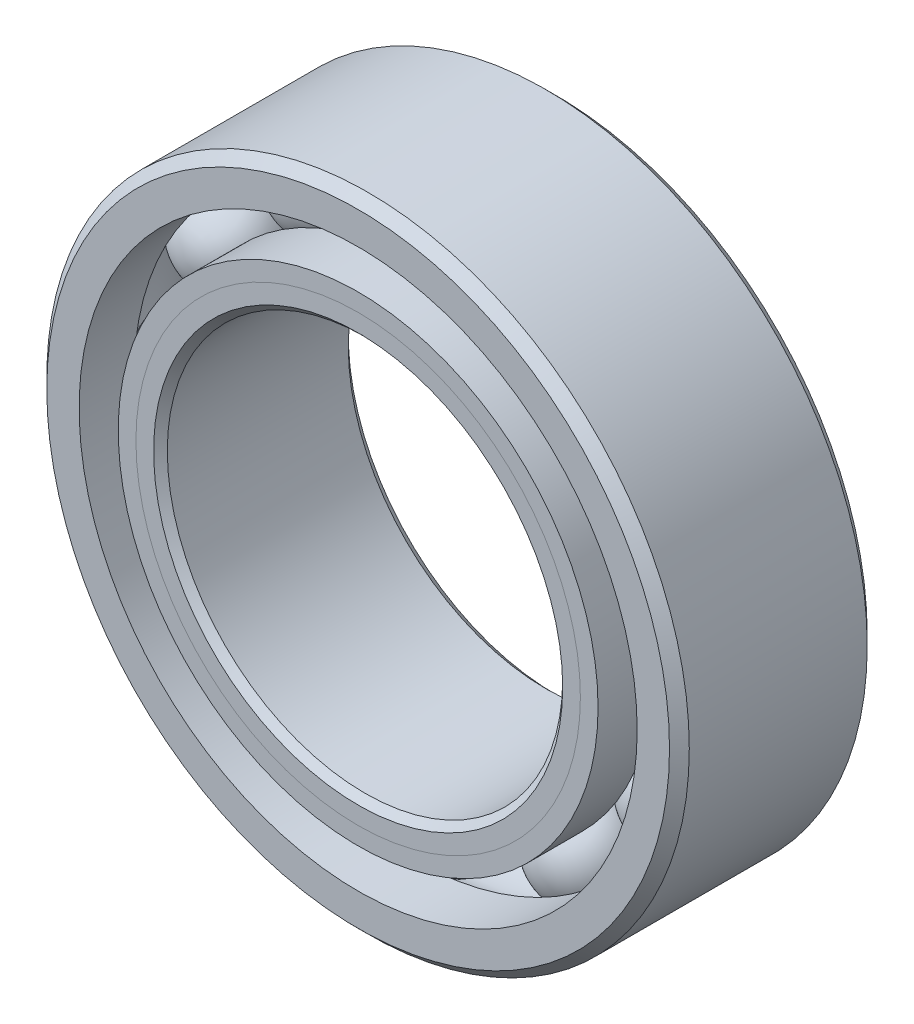
ISO-10303-21;
HEADER;
FILE_DESCRIPTION(('STEP AP214'),'2;1');
FILE_NAME('part.step','',(''),(''),'','','');
FILE_SCHEMA(('AUTOMOTIVE_DESIGN { 1 0 10303 214 1 1 1 1 }'));
ENDSEC;
DATA;
#1=APPLICATION_CONTEXT('core data for automotive mechanical design processes');
#2=APPLICATION_PROTOCOL_DEFINITION('international standard','automotive_design',2000,#1);
#3=PRODUCT_CONTEXT('',#1,'mechanical');
#4=PRODUCT('Part','Part','',(#3));
#5=PRODUCT_RELATED_PRODUCT_CATEGORY('part','',(#4));
#6=PRODUCT_DEFINITION_FORMATION('','',#4);
#7=PRODUCT_DEFINITION_CONTEXT('part definition',#1,'design');
#8=PRODUCT_DEFINITION('design','',#6,#7);
#9=PRODUCT_DEFINITION_SHAPE('','',#8);
#10=(LENGTH_UNIT() NAMED_UNIT(*) SI_UNIT(.MILLI.,.METRE.));
#11=(NAMED_UNIT(*) PLANE_ANGLE_UNIT() SI_UNIT($,.RADIAN.));
#12=(NAMED_UNIT(*) SI_UNIT($,.STERADIAN.) SOLID_ANGLE_UNIT());
#13=UNCERTAINTY_MEASURE_WITH_UNIT(LENGTH_MEASURE(1.E-05),#10,'distance_accuracy_value','');
#14=(GEOMETRIC_REPRESENTATION_CONTEXT(3) GLOBAL_UNCERTAINTY_ASSIGNED_CONTEXT((#13)) GLOBAL_UNIT_ASSIGNED_CONTEXT((#10,
#11,#12)) REPRESENTATION_CONTEXT('',''));
#15=CARTESIAN_POINT('',(0.,0.,0.));
#16=DIRECTION('',(0.,0.,1.));
#17=DIRECTION('',(1.,0.,0.));
#18=AXIS2_PLACEMENT_3D('',#15,#16,#17);
#19=CARTESIAN_POINT('',(-8.33437499999981,14.435560949332,0.));
#20=DIRECTION('',(0.,0.,1.));
#21=DIRECTION('',(-0.499999999999989,0.866025403784445,0.));
#22=AXIS2_PLACEMENT_3D('',#19,#20,#21);
#23=SPHERICAL_SURFACE('',#22,3.08910742628344);
#24=CARTESIAN_POINT('',(-8.33437499999981,14.435560949332,3.08910742628344));
#25=VERTEX_POINT('',#24);
#26=VERTEX_LOOP('',#25);
#27=FACE_BOUND('',#26,.T.);
#28=ADVANCED_FACE('F37',(#27),#23,.T.);
#29=CLOSED_SHELL('',(#28));
#30=MANIFOLD_SOLID_BREP('B2',#29);
#31=CARTESIAN_POINT('',(-14.4355609493318,8.33437500000017,0.));
#32=DIRECTION('',(0.,0.,1.));
#33=DIRECTION('',(-0.866025403784433,0.50000000000001,0.));
#34=AXIS2_PLACEMENT_3D('',#31,#32,#33);
#35=SPHERICAL_SURFACE('',#34,3.08910742628344);
#36=CARTESIAN_POINT('',(-14.4355609493318,8.33437500000017,3.08910742628344));
#37=VERTEX_POINT('',#36);
#38=VERTEX_LOOP('',#37);
#39=FACE_BOUND('',#38,.T.);
#40=ADVANCED_FACE('F68',(#39),#35,.T.);
#41=CLOSED_SHELL('',(#40));
#42=MANIFOLD_SOLID_BREP('B6',#41);
#43=CARTESIAN_POINT('',(-16.66875,1.74595888700524E-13,0.));
#44=DIRECTION('',(0.,0.,1.));
#45=DIRECTION('',(-1.,0.,0.));
#46=AXIS2_PLACEMENT_3D('',#43,#44,#45);
#47=SPHERICAL_SURFACE('',#46,3.08910742628344);
#48=CARTESIAN_POINT('',(-16.66875,1.74595888700524E-13,3.08910742628344));
#49=VERTEX_POINT('',#48);
#50=VERTEX_LOOP('',#49);
#51=FACE_BOUND('',#50,.T.);
#52=ADVANCED_FACE('F99',(#51),#47,.T.);
#53=CLOSED_SHELL('',(#52));
#54=MANIFOLD_SOLID_BREP('B33',#53);
#55=CARTESIAN_POINT('',(-14.4355609493319,-8.33437499999987,0.));
#56=DIRECTION('',(0.,0.,1.));
#57=DIRECTION('',(-0.866025403784443,-0.499999999999992,0.));
#58=AXIS2_PLACEMENT_3D('',#55,#56,#57);
#59=SPHERICAL_SURFACE('',#58,3.08910742628344);
#60=CARTESIAN_POINT('',(-14.4355609493319,-8.33437499999987,3.08910742628344));
#61=VERTEX_POINT('',#60);
#62=VERTEX_LOOP('',#61);
#63=FACE_BOUND('',#62,.T.);
#64=ADVANCED_FACE('F130',(#63),#59,.T.);
#65=CLOSED_SHELL('',(#64));
#66=MANIFOLD_SOLID_BREP('B64',#65);
#67=CARTESIAN_POINT('',(-8.33437500000012,-14.4355609493318,0.));
#68=DIRECTION('',(0.,0.,1.));
#69=DIRECTION('',(-0.500000000000007,-0.866025403784435,0.));
#70=AXIS2_PLACEMENT_3D('',#67,#68,#69);
#71=SPHERICAL_SURFACE('',#70,3.08910742628344);
#72=CARTESIAN_POINT('',(-8.33437500000012,-14.4355609493318,3.08910742628344));
#73=VERTEX_POINT('',#72);
#74=VERTEX_LOOP('',#73);
#75=FACE_BOUND('',#74,.T.);
#76=ADVANCED_FACE('F161',(#75),#71,.T.);
#77=CLOSED_SHELL('',(#76));
#78=MANIFOLD_SOLID_BREP('B95',#77);
#79=CARTESIAN_POINT('',(-1.16397259133683E-13,-16.66875,0.));
#80=DIRECTION('',(0.,0.,1.));
#81=DIRECTION('',(0.,-1.,0.));
#82=AXIS2_PLACEMENT_3D('',#79,#80,#81);
#83=SPHERICAL_SURFACE('',#82,3.08910742628344);
#84=CARTESIAN_POINT('',(-1.16397259133683E-13,-16.66875,3.08910742628344));
#85=VERTEX_POINT('',#84);
#86=VERTEX_LOOP('',#85);
#87=FACE_BOUND('',#86,.T.);
#88=ADVANCED_FACE('F192',(#87),#83,.T.);
#89=CLOSED_SHELL('',(#88));
#90=MANIFOLD_SOLID_BREP('B126',#89);
#91=CARTESIAN_POINT('',(8.33437499999991,-14.4355609493319,0.));
#92=DIRECTION('',(0.,0.,1.));
#93=DIRECTION('',(0.499999999999995,-0.866025403784442,0.));
#94=AXIS2_PLACEMENT_3D('',#91,#92,#93);
#95=SPHERICAL_SURFACE('',#94,3.08910742628344);
#96=CARTESIAN_POINT('',(8.33437499999991,-14.4355609493319,3.08910742628344));
#97=VERTEX_POINT('',#96);
#98=VERTEX_LOOP('',#97);
#99=FACE_BOUND('',#98,.T.);
#100=ADVANCED_FACE('F223',(#99),#95,.T.);
#101=CLOSED_SHELL('',(#100));
#102=MANIFOLD_SOLID_BREP('B157',#101);
#103=CARTESIAN_POINT('',(14.4355609493318,-8.33437500000007,0.));
#104=DIRECTION('',(0.,0.,1.));
#105=DIRECTION('',(0.866025403784436,-0.500000000000004,0.));
#106=AXIS2_PLACEMENT_3D('',#103,#104,#105);
#107=SPHERICAL_SURFACE('',#106,3.08910742628344);
#108=CARTESIAN_POINT('',(14.4355609493318,-8.33437500000007,3.08910742628344));
#109=VERTEX_POINT('',#108);
#110=VERTEX_LOOP('',#109);
#111=FACE_BOUND('',#110,.T.);
#112=ADVANCED_FACE('F254',(#111),#107,.T.);
#113=CLOSED_SHELL('',(#112));
#114=MANIFOLD_SOLID_BREP('B188',#113);
#115=CARTESIAN_POINT('',(16.66875,0.,0.));
#116=DIRECTION('',(0.,0.,1.));
#117=DIRECTION('',(1.,0.,0.));
#118=AXIS2_PLACEMENT_3D('',#115,#116,#117);
#119=SPHERICAL_SURFACE('',#118,3.08910742628344);
#120=CARTESIAN_POINT('',(16.66875,0.,3.08910742628344));
#121=VERTEX_POINT('',#120);
#122=VERTEX_LOOP('',#121);
#123=FACE_BOUND('',#122,.T.);
#124=ADVANCED_FACE('F285',(#123),#119,.T.);
#125=CLOSED_SHELL('',(#124));
#126=MANIFOLD_SOLID_BREP('B219',#125);
#127=CARTESIAN_POINT('',(14.4355609493319,8.33437499999997,0.));
#128=DIRECTION('',(0.,0.,1.));
#129=DIRECTION('',(0.86602540378444,0.499999999999998,0.));
#130=AXIS2_PLACEMENT_3D('',#127,#128,#129);
#131=SPHERICAL_SURFACE('',#130,3.08910742628344);
#132=CARTESIAN_POINT('',(14.4355609493319,8.33437499999997,3.08910742628344));
#133=VERTEX_POINT('',#132);
#134=VERTEX_LOOP('',#133);
#135=FACE_BOUND('',#134,.T.);
#136=ADVANCED_FACE('F316',(#135),#131,.T.);
#137=CLOSED_SHELL('',(#136));
#138=MANIFOLD_SOLID_BREP('B250',#137);
#139=CARTESIAN_POINT('',(8.33437500000002,14.4355609493319,0.));
#140=DIRECTION('',(0.,0.,1.));
#141=DIRECTION('',(0.500000000000001,0.866025403784438,0.));
#142=AXIS2_PLACEMENT_3D('',#139,#140,#141);
#143=SPHERICAL_SURFACE('',#142,3.08910742628344);
#144=CARTESIAN_POINT('',(8.33437500000002,14.4355609493319,3.08910742628344));
#145=VERTEX_POINT('',#144);
#146=VERTEX_LOOP('',#145);
#147=FACE_BOUND('',#146,.T.);
#148=ADVANCED_FACE('F347',(#147),#143,.T.);
#149=CLOSED_SHELL('',(#148));
#150=MANIFOLD_SOLID_BREP('B281',#149);
#151=CARTESIAN_POINT('',(0.,16.66875,0.));
#152=DIRECTION('',(0.,0.,1.));
#153=DIRECTION('',(0.,1.,0.));
#154=AXIS2_PLACEMENT_3D('',#151,#152,#153);
#155=SPHERICAL_SURFACE('',#154,3.08910742628344);
#156=CARTESIAN_POINT('',(0.,16.66875,3.08910742628344));
#157=VERTEX_POINT('',#156);
#158=VERTEX_LOOP('',#157);
#159=FACE_BOUND('',#158,.T.);
#160=ADVANCED_FACE('F380',(#159),#155,.T.);
#161=CLOSED_SHELL('',(#160));
#162=MANIFOLD_SOLID_BREP('B312',#161);
#163=CARTESIAN_POINT('',(0.,14.2762636654072,6.35));
#164=DIRECTION('',(0.,0.,-1.));
#165=DIRECTION('',(-1.,0.,0.));
#166=AXIS2_PLACEMENT_3D('',#163,#164,#165);
#167=PLANE('',#166);
#168=CARTESIAN_POINT('',(0.,0.,6.35));
#169=DIRECTION('',(0.,0.,1.));
#170=DIRECTION('',(1.,0.,0.));
#171=AXIS2_PLACEMENT_3D('',#168,#169,#170);
#172=CIRCLE('',#171,13.1398212868583);
#173=CARTESIAN_POINT('',(13.1398212868583,0.,6.35));
#174=VERTEX_POINT('',#173);
#175=EDGE_CURVE('E434',#174,#174,#172,.T.);
#176=ORIENTED_EDGE('',*,*,#175,.F.);
#177=EDGE_LOOP('',(#176));
#178=FACE_BOUND('',#177,.T.);
#179=CARTESIAN_POINT('',(0.,0.,6.35));
#180=DIRECTION('',(0.,0.,1.));
#181=DIRECTION('',(1.,0.,0.));
#182=AXIS2_PLACEMENT_3D('',#179,#180,#181);
#183=CIRCLE('',#182,14.2762636654072);
#184=CARTESIAN_POINT('',(14.2762636654072,0.,6.35));
#185=VERTEX_POINT('',#184);
#186=EDGE_CURVE('E379',#185,#185,#183,.T.);
#187=ORIENTED_EDGE('',*,*,#186,.T.);
#188=EDGE_LOOP('',(#187));
#189=FACE_BOUND('',#188,.T.);
#190=ADVANCED_FACE('F400',(#178,#189),#167,.F.);
#191=CARTESIAN_POINT('',(0.,0.,5.21355762145112));
#192=DIRECTION('',(0.,0.,1.));
#193=DIRECTION('',(1.,0.,0.));
#194=AXIS2_PLACEMENT_3D('',#191,#192,#193);
#195=CONICAL_SURFACE('',#194,13.1398212868583,0.78539816339745);
#196=ORIENTED_EDGE('',*,*,#186,.F.);
#197=EDGE_LOOP('',(#196));
#198=FACE_BOUND('',#197,.T.);
#199=CARTESIAN_POINT('',(0.,0.,5.21355762145112));
#200=DIRECTION('',(0.,0.,1.));
#201=DIRECTION('',(1.,0.,0.));
#202=AXIS2_PLACEMENT_3D('',#199,#200,#201);
#203=CIRCLE('',#202,13.1398212868583);
#204=CARTESIAN_POINT('',(13.1398212868583,0.,5.21355762145112));
#205=VERTEX_POINT('',#204);
#206=EDGE_CURVE('E406',#205,#205,#203,.T.);
#207=ORIENTED_EDGE('',*,*,#206,.T.);
#208=EDGE_LOOP('',(#207));
#209=FACE_BOUND('',#208,.T.);
#210=ADVANCED_FACE('F441',(#198,#209),#195,.T.);
#211=CARTESIAN_POINT('',(0.,0.,6.35));
#212=DIRECTION('',(0.,0.,1.));
#213=DIRECTION('',(1.,0.,0.));
#214=AXIS2_PLACEMENT_3D('',#211,#212,#213);
#215=CYLINDRICAL_SURFACE('',#214,13.1398212868583);
#216=ORIENTED_EDGE('',*,*,#206,.F.);
#217=EDGE_LOOP('',(#216));
#218=FACE_BOUND('',#217,.T.);
#219=CARTESIAN_POINT('',(0.,0.,0.));
#220=DIRECTION('',(0.,0.,1.));
#221=DIRECTION('',(1.,0.,0.));
#222=AXIS2_PLACEMENT_3D('',#219,#220,#221);
#223=CIRCLE('',#222,13.1398212868583);
#224=CARTESIAN_POINT('',(13.1398212868583,0.,0.));
#225=VERTEX_POINT('',#224);
#226=EDGE_CURVE('E410',#225,#225,#223,.T.);
#227=ORIENTED_EDGE('',*,*,#226,.T.);
#228=EDGE_LOOP('',(#227));
#229=FACE_BOUND('',#228,.T.);
#230=ADVANCED_FACE('F445',(#218,#229),#215,.T.);
#231=CARTESIAN_POINT('',(0.,13.1398212868583,0.));
#232=DIRECTION('',(0.,0.,-1.));
#233=DIRECTION('',(-1.,0.,0.));
#234=AXIS2_PLACEMENT_3D('',#231,#232,#233);
#235=PLANE('',#234);
#236=ORIENTED_EDGE('',*,*,#226,.F.);
#237=EDGE_LOOP('',(#236));
#238=FACE_BOUND('',#237,.T.);
#239=CARTESIAN_POINT('',(0.,0.,0.));
#240=DIRECTION('',(0.,0.,1.));
#241=DIRECTION('',(1.,0.,0.));
#242=AXIS2_PLACEMENT_3D('',#239,#240,#241);
#243=CIRCLE('',#242,13.5796425737166);
#244=CARTESIAN_POINT('',(13.5796425737166,0.,0.));
#245=VERTEX_POINT('',#244);
#246=EDGE_CURVE('E414',#245,#245,#243,.T.);
#247=ORIENTED_EDGE('',*,*,#246,.T.);
#248=EDGE_LOOP('',(#247));
#249=FACE_BOUND('',#248,.T.);
#250=ADVANCED_FACE('F450',(#238,#249),#235,.F.);
#251=CARTESIAN_POINT('',(0.,0.,0.));
#252=DIRECTION('',(0.,0.,1.));
#253=DIRECTION('',(1.,0.,0.));
#254=AXIS2_PLACEMENT_3D('',#251,#252,#253);
#255=TOROIDAL_SURFACE('',#254,16.66875,3.08910742628344);
#256=ORIENTED_EDGE('',*,*,#246,.F.);
#257=EDGE_LOOP('',(#256));
#258=FACE_BOUND('',#257,.T.);
#259=CARTESIAN_POINT('',(0.,0.,-2.82222222222222));
#260=DIRECTION('',(0.,0.,1.));
#261=DIRECTION('',(1.,0.,0.));
#262=AXIS2_PLACEMENT_3D('',#259,#260,#261);
#263=CIRCLE('',#262,15.412706043956);
#264=CARTESIAN_POINT('',(15.412706043956,0.,-2.82222222222222));
#265=VERTEX_POINT('',#264);
#266=EDGE_CURVE('E419',#265,#265,#263,.T.);
#267=ORIENTED_EDGE('',*,*,#266,.T.);
#268=EDGE_LOOP('',(#267));
#269=FACE_BOUND('',#268,.T.);
#270=ADVANCED_FACE('F456',(#258,#269),#255,.F.);
#271=CARTESIAN_POINT('',(0.,0.,6.35));
#272=DIRECTION('',(0.,0.,1.));
#273=DIRECTION('',(1.,0.,0.));
#274=AXIS2_PLACEMENT_3D('',#271,#272,#273);
#275=CYLINDRICAL_SURFACE('',#274,15.412706043956);
#276=ORIENTED_EDGE('',*,*,#266,.F.);
#277=EDGE_LOOP('',(#276));
#278=FACE_BOUND('',#277,.T.);
#279=CARTESIAN_POINT('',(0.,0.,-6.35));
#280=DIRECTION('',(0.,0.,1.));
#281=DIRECTION('',(1.,0.,0.));
#282=AXIS2_PLACEMENT_3D('',#279,#280,#281);
#283=CIRCLE('',#282,15.412706043956);
#284=CARTESIAN_POINT('',(15.412706043956,0.,-6.35));
#285=VERTEX_POINT('',#284);
#286=EDGE_CURVE('E422',#285,#285,#283,.T.);
#287=ORIENTED_EDGE('',*,*,#286,.T.);
#288=EDGE_LOOP('',(#287));
#289=FACE_BOUND('',#288,.T.);
#290=ADVANCED_FACE('F460',(#278,#289),#275,.T.);
#291=CARTESIAN_POINT('',(0.,13.335,-6.35));
#292=DIRECTION('',(0.,0.,1.));
#293=DIRECTION('',(1.,0.,0.));
#294=AXIS2_PLACEMENT_3D('',#291,#292,#293);
#295=PLANE('',#294);
#296=ORIENTED_EDGE('',*,*,#286,.F.);
#297=EDGE_LOOP('',(#296));
#298=FACE_BOUND('',#297,.T.);
#299=CARTESIAN_POINT('',(0.,0.,-6.35));
#300=DIRECTION('',(0.,0.,1.));
#301=DIRECTION('',(1.,0.,0.));
#302=AXIS2_PLACEMENT_3D('',#299,#300,#301);
#303=CIRCLE('',#302,13.335);
#304=CARTESIAN_POINT('',(13.335,0.,-6.35));
#305=VERTEX_POINT('',#304);
#306=EDGE_CURVE('E425',#305,#305,#303,.T.);
#307=ORIENTED_EDGE('',*,*,#306,.T.);
#308=EDGE_LOOP('',(#307));
#309=FACE_BOUND('',#308,.T.);
#310=ADVANCED_FACE('F464',(#298,#309),#295,.F.);
#311=CARTESIAN_POINT('',(0.,0.,-5.715));
#312=DIRECTION('',(0.,0.,-1.));
#313=DIRECTION('',(-1.,0.,0.));
#314=AXIS2_PLACEMENT_3D('',#311,#312,#313);
#315=CONICAL_SURFACE('',#314,12.7,0.785398163397444);
#316=ORIENTED_EDGE('',*,*,#306,.F.);
#317=EDGE_LOOP('',(#316));
#318=FACE_BOUND('',#317,.T.);
#319=CARTESIAN_POINT('',(0.,0.,-5.715));
#320=DIRECTION('',(0.,0.,1.));
#321=DIRECTION('',(1.,0.,0.));
#322=AXIS2_PLACEMENT_3D('',#319,#320,#321);
#323=CIRCLE('',#322,12.7);
#324=CARTESIAN_POINT('',(12.7,0.,-5.715));
#325=VERTEX_POINT('',#324);
#326=EDGE_CURVE('E428',#325,#325,#323,.T.);
#327=ORIENTED_EDGE('',*,*,#326,.T.);
#328=EDGE_LOOP('',(#327));
#329=FACE_BOUND('',#328,.T.);
#330=ADVANCED_FACE('F468',(#318,#329),#315,.F.);
#331=CARTESIAN_POINT('',(0.,0.,6.35));
#332=DIRECTION('',(0.,0.,1.));
#333=DIRECTION('',(1.,0.,0.));
#334=AXIS2_PLACEMENT_3D('',#331,#332,#333);
#335=CYLINDRICAL_SURFACE('',#334,12.7);
#336=ORIENTED_EDGE('',*,*,#326,.F.);
#337=EDGE_LOOP('',(#336));
#338=FACE_BOUND('',#337,.T.);
#339=CARTESIAN_POINT('',(0.,0.,5.91017871314172));
#340=DIRECTION('',(0.,0.,1.));
#341=DIRECTION('',(1.,0.,0.));
#342=AXIS2_PLACEMENT_3D('',#339,#340,#341);
#343=CIRCLE('',#342,12.7);
#344=CARTESIAN_POINT('',(12.7,0.,5.91017871314172));
#345=VERTEX_POINT('',#344);
#346=EDGE_CURVE('E431',#345,#345,#343,.T.);
#347=ORIENTED_EDGE('',*,*,#346,.T.);
#348=EDGE_LOOP('',(#347));
#349=FACE_BOUND('',#348,.T.);
#350=ADVANCED_FACE('F472',(#338,#349),#335,.F.);
#351=CARTESIAN_POINT('',(0.,0.,6.35));
#352=DIRECTION('',(0.,0.,1.));
#353=DIRECTION('',(1.,0.,0.));
#354=AXIS2_PLACEMENT_3D('',#351,#352,#353);
#355=CONICAL_SURFACE('',#354,13.1398212868583,0.78539816339745);
#356=ORIENTED_EDGE('',*,*,#346,.F.);
#357=EDGE_LOOP('',(#356));
#358=FACE_BOUND('',#357,.T.);
#359=ORIENTED_EDGE('',*,*,#175,.T.);
#360=EDGE_LOOP('',(#359));
#361=FACE_BOUND('',#360,.T.);
#362=ADVANCED_FACE('F438',(#358,#361),#355,.F.);
#363=CLOSED_SHELL('',(#190,#210,#230,#250,#270,#290,#310,#330,#350,#362));
#364=MANIFOLD_SOLID_BREP('B343',#363);
#365=CARTESIAN_POINT('',(0.,15.412706043956,6.35));
#366=DIRECTION('',(0.,0.,-1.));
#367=DIRECTION('',(-1.,0.,0.));
#368=AXIS2_PLACEMENT_3D('',#365,#366,#367);
#369=PLANE('',#368);
#370=CARTESIAN_POINT('',(0.,0.,6.35));
#371=DIRECTION('',(0.,0.,1.));
#372=DIRECTION('',(1.,0.,0.));
#373=AXIS2_PLACEMENT_3D('',#370,#371,#372);
#374=CIRCLE('',#373,14.2762636654072);
#375=CARTESIAN_POINT('',(14.2762636654072,0.,6.35));
#376=VERTEX_POINT('',#375);
#377=EDGE_CURVE('E399',#376,#376,#374,.T.);
#378=ORIENTED_EDGE('',*,*,#377,.F.);
#379=EDGE_LOOP('',(#378));
#380=FACE_BOUND('',#379,.T.);
#381=CARTESIAN_POINT('',(0.,0.,6.35));
#382=DIRECTION('',(0.,0.,1.));
#383=DIRECTION('',(1.,0.,0.));
#384=AXIS2_PLACEMENT_3D('',#381,#382,#383);
#385=CIRCLE('',#384,15.412706043956);
#386=CARTESIAN_POINT('',(15.412706043956,0.,6.35));
#387=VERTEX_POINT('',#386);
#388=EDGE_CURVE('E580',#387,#387,#385,.T.);
#389=ORIENTED_EDGE('',*,*,#388,.T.);
#390=EDGE_LOOP('',(#389));
#391=FACE_BOUND('',#390,.T.);
#392=ADVANCED_FACE('F558',(#380,#391),#369,.F.);
#393=CARTESIAN_POINT('',(0.,0.,6.35));
#394=DIRECTION('',(0.,0.,1.));
#395=DIRECTION('',(1.,0.,0.));
#396=AXIS2_PLACEMENT_3D('',#393,#394,#395);
#397=CONICAL_SURFACE('',#396,14.2762636654072,0.78539816339745);
#398=CARTESIAN_POINT('',(0.,0.,5.21355762145112));
#399=DIRECTION('',(0.,0.,1.));
#400=DIRECTION('',(1.,0.,0.));
#401=AXIS2_PLACEMENT_3D('',#398,#399,#400);
#402=CIRCLE('',#401,13.1398212868583);
#403=CARTESIAN_POINT('',(13.1398212868583,0.,5.21355762145112));
#404=VERTEX_POINT('',#403);
#405=EDGE_CURVE('E564',#404,#404,#402,.T.);
#406=ORIENTED_EDGE('',*,*,#405,.F.);
#407=EDGE_LOOP('',(#406));
#408=FACE_BOUND('',#407,.T.);
#409=ORIENTED_EDGE('',*,*,#377,.T.);
#410=EDGE_LOOP('',(#409));
#411=FACE_BOUND('',#410,.T.);
#412=ADVANCED_FACE('F605',(#408,#411),#397,.F.);
#413=CARTESIAN_POINT('',(0.,0.,6.35));
#414=DIRECTION('',(0.,0.,1.));
#415=DIRECTION('',(1.,0.,0.));
#416=AXIS2_PLACEMENT_3D('',#413,#414,#415);
#417=CYLINDRICAL_SURFACE('',#416,13.1398212868583);
#418=CARTESIAN_POINT('',(0.,0.,0.));
#419=DIRECTION('',(0.,0.,1.));
#420=DIRECTION('',(1.,0.,0.));
#421=AXIS2_PLACEMENT_3D('',#418,#419,#420);
#422=CIRCLE('',#421,13.1398212868583);
#423=CARTESIAN_POINT('',(13.1398212868583,0.,0.));
#424=VERTEX_POINT('',#423);
#425=EDGE_CURVE('E568',#424,#424,#422,.T.);
#426=ORIENTED_EDGE('',*,*,#425,.F.);
#427=EDGE_LOOP('',(#426));
#428=FACE_BOUND('',#427,.T.);
#429=ORIENTED_EDGE('',*,*,#405,.T.);
#430=EDGE_LOOP('',(#429));
#431=FACE_BOUND('',#430,.T.);
#432=ADVANCED_FACE('F600',(#428,#431),#417,.F.);
#433=CARTESIAN_POINT('',(0.,13.1398212868583,0.));
#434=DIRECTION('',(0.,0.,1.));
#435=DIRECTION('',(1.,0.,0.));
#436=AXIS2_PLACEMENT_3D('',#433,#434,#435);
#437=PLANE('',#436);
#438=CARTESIAN_POINT('',(0.,0.,0.));
#439=DIRECTION('',(0.,0.,1.));
#440=DIRECTION('',(1.,0.,0.));
#441=AXIS2_PLACEMENT_3D('',#438,#439,#440);
#442=CIRCLE('',#441,13.5796425737166);
#443=CARTESIAN_POINT('',(13.5796425737166,0.,0.));
#444=VERTEX_POINT('',#443);
#445=EDGE_CURVE('E572',#444,#444,#442,.T.);
#446=ORIENTED_EDGE('',*,*,#445,.F.);
#447=EDGE_LOOP('',(#446));
#448=FACE_BOUND('',#447,.T.);
#449=ORIENTED_EDGE('',*,*,#425,.T.);
#450=EDGE_LOOP('',(#449));
#451=FACE_BOUND('',#450,.T.);
#452=ADVANCED_FACE('F594',(#448,#451),#437,.F.);
#453=CARTESIAN_POINT('',(0.,0.,0.));
#454=DIRECTION('',(0.,0.,1.));
#455=DIRECTION('',(1.,0.,0.));
#456=AXIS2_PLACEMENT_3D('',#453,#454,#455);
#457=TOROIDAL_SURFACE('',#456,16.66875,3.08910742628344);
#458=CARTESIAN_POINT('',(0.,0.,2.82222222222222));
#459=DIRECTION('',(0.,0.,1.));
#460=DIRECTION('',(1.,0.,0.));
#461=AXIS2_PLACEMENT_3D('',#458,#459,#460);
#462=CIRCLE('',#461,15.412706043956);
#463=CARTESIAN_POINT('',(15.412706043956,0.,2.82222222222222));
#464=VERTEX_POINT('',#463);
#465=EDGE_CURVE('E577',#464,#464,#462,.T.);
#466=ORIENTED_EDGE('',*,*,#465,.F.);
#467=EDGE_LOOP('',(#466));
#468=FACE_BOUND('',#467,.T.);
#469=ORIENTED_EDGE('',*,*,#445,.T.);
#470=EDGE_LOOP('',(#469));
#471=FACE_BOUND('',#470,.T.);
#472=ADVANCED_FACE('F588',(#468,#471),#457,.F.);
#473=CARTESIAN_POINT('',(0.,0.,6.35));
#474=DIRECTION('',(0.,0.,1.));
#475=DIRECTION('',(1.,0.,0.));
#476=AXIS2_PLACEMENT_3D('',#473,#474,#475);
#477=CYLINDRICAL_SURFACE('',#476,15.412706043956);
#478=ORIENTED_EDGE('',*,*,#388,.F.);
#479=EDGE_LOOP('',(#478));
#480=FACE_BOUND('',#479,.T.);
#481=ORIENTED_EDGE('',*,*,#465,.T.);
#482=EDGE_LOOP('',(#481));
#483=FACE_BOUND('',#482,.T.);
#484=ADVANCED_FACE('F585',(#480,#483),#477,.T.);
#485=CLOSED_SHELL('',(#392,#412,#432,#452,#472,#484));
#486=MANIFOLD_SOLID_BREP('B374',#485);
#487=CARTESIAN_POINT('',(0.,0.,5.715));
#488=DIRECTION('',(0.,0.,-1.));
#489=DIRECTION('',(-1.,0.,0.));
#490=AXIS2_PLACEMENT_3D('',#487,#488,#489);
#491=CONICAL_SURFACE('',#490,20.6375,0.785398163397446);
#492=CARTESIAN_POINT('',(0.,0.,6.35));
#493=DIRECTION('',(0.,0.,1.));
#494=DIRECTION('',(1.,0.,0.));
#495=AXIS2_PLACEMENT_3D('',#492,#493,#494);
#496=CIRCLE('',#495,20.0025);
#497=CARTESIAN_POINT('',(20.0025,0.,6.35));
#498=VERTEX_POINT('',#497);
#499=EDGE_CURVE('E677',#498,#498,#496,.T.);
#500=ORIENTED_EDGE('',*,*,#499,.F.);
#501=EDGE_LOOP('',(#500));
#502=FACE_BOUND('',#501,.T.);
#503=CARTESIAN_POINT('',(0.,0.,5.715));
#504=DIRECTION('',(0.,0.,1.));
#505=DIRECTION('',(1.,0.,0.));
#506=AXIS2_PLACEMENT_3D('',#503,#504,#505);
#507=CIRCLE('',#506,20.6375);
#508=CARTESIAN_POINT('',(20.6375,0.,5.715));
#509=VERTEX_POINT('',#508);
#510=EDGE_CURVE('E557',#509,#509,#507,.T.);
#511=ORIENTED_EDGE('',*,*,#510,.T.);
#512=EDGE_LOOP('',(#511));
#513=FACE_BOUND('',#512,.T.);
#514=ADVANCED_FACE('F649',(#502,#513),#491,.T.);
#515=CARTESIAN_POINT('',(0.,0.,6.35));
#516=DIRECTION('',(0.,0.,1.));
#517=DIRECTION('',(1.,0.,0.));
#518=AXIS2_PLACEMENT_3D('',#515,#516,#517);
#519=CYLINDRICAL_SURFACE('',#518,20.6375);
#520=ORIENTED_EDGE('',*,*,#510,.F.);
#521=EDGE_LOOP('',(#520));
#522=FACE_BOUND('',#521,.T.);
#523=CARTESIAN_POINT('',(0.,0.,-5.715));
#524=DIRECTION('',(0.,0.,1.));
#525=DIRECTION('',(1.,0.,0.));
#526=AXIS2_PLACEMENT_3D('',#523,#524,#525);
#527=CIRCLE('',#526,20.6375);
#528=CARTESIAN_POINT('',(20.6375,0.,-5.715));
#529=VERTEX_POINT('',#528);
#530=EDGE_CURVE('E655',#529,#529,#527,.T.);
#531=ORIENTED_EDGE('',*,*,#530,.T.);
#532=EDGE_LOOP('',(#531));
#533=FACE_BOUND('',#532,.T.);
#534=ADVANCED_FACE('F684',(#522,#533),#519,.T.);
#535=CARTESIAN_POINT('',(0.,0.,-6.35));
#536=DIRECTION('',(0.,0.,1.));
#537=DIRECTION('',(1.,0.,0.));
#538=AXIS2_PLACEMENT_3D('',#535,#536,#537);
#539=CONICAL_SURFACE('',#538,20.0025,0.785398163397446);
#540=ORIENTED_EDGE('',*,*,#530,.F.);
#541=EDGE_LOOP('',(#540));
#542=FACE_BOUND('',#541,.T.);
#543=CARTESIAN_POINT('',(0.,0.,-6.35));
#544=DIRECTION('',(0.,0.,1.));
#545=DIRECTION('',(1.,0.,0.));
#546=AXIS2_PLACEMENT_3D('',#543,#544,#545);
#547=CIRCLE('',#546,20.0025);
#548=CARTESIAN_POINT('',(20.0025,0.,-6.35));
#549=VERTEX_POINT('',#548);
#550=EDGE_CURVE('E659',#549,#549,#547,.T.);
#551=ORIENTED_EDGE('',*,*,#550,.T.);
#552=EDGE_LOOP('',(#551));
#553=FACE_BOUND('',#552,.T.);
#554=ADVANCED_FACE('F688',(#542,#553),#539,.T.);
#555=CARTESIAN_POINT('',(0.,20.0025,-6.35));
#556=DIRECTION('',(0.,0.,1.));
#557=DIRECTION('',(1.,0.,0.));
#558=AXIS2_PLACEMENT_3D('',#555,#556,#557);
#559=PLANE('',#558);
#560=ORIENTED_EDGE('',*,*,#550,.F.);
#561=EDGE_LOOP('',(#560));
#562=FACE_BOUND('',#561,.T.);
#563=CARTESIAN_POINT('',(0.,0.,-6.35));
#564=DIRECTION('',(0.,0.,1.));
#565=DIRECTION('',(1.,0.,0.));
#566=AXIS2_PLACEMENT_3D('',#563,#564,#565);
#567=CIRCLE('',#566,17.924793956044);
#568=CARTESIAN_POINT('',(17.924793956044,0.,-6.35));
#569=VERTEX_POINT('',#568);
#570=EDGE_CURVE('E663',#569,#569,#567,.T.);
#571=ORIENTED_EDGE('',*,*,#570,.T.);
#572=EDGE_LOOP('',(#571));
#573=FACE_BOUND('',#572,.T.);
#574=ADVANCED_FACE('F693',(#562,#573),#559,.F.);
#575=CARTESIAN_POINT('',(0.,0.,6.35));
#576=DIRECTION('',(0.,0.,1.));
#577=DIRECTION('',(1.,0.,0.));
#578=AXIS2_PLACEMENT_3D('',#575,#576,#577);
#579=CYLINDRICAL_SURFACE('',#578,17.924793956044);
#580=ORIENTED_EDGE('',*,*,#570,.F.);
#581=EDGE_LOOP('',(#580));
#582=FACE_BOUND('',#581,.T.);
#583=CARTESIAN_POINT('',(0.,0.,-2.82222222222222));
#584=DIRECTION('',(0.,0.,1.));
#585=DIRECTION('',(1.,0.,0.));
#586=AXIS2_PLACEMENT_3D('',#583,#584,#585);
#587=CIRCLE('',#586,17.924793956044);
#588=CARTESIAN_POINT('',(17.924793956044,0.,-2.82222222222222));
#589=VERTEX_POINT('',#588);
#590=EDGE_CURVE('E668',#589,#589,#587,.T.);
#591=ORIENTED_EDGE('',*,*,#590,.T.);
#592=EDGE_LOOP('',(#591));
#593=FACE_BOUND('',#592,.T.);
#594=ADVANCED_FACE('F699',(#582,#593),#579,.F.);
#595=CARTESIAN_POINT('',(0.,0.,0.));
#596=DIRECTION('',(0.,0.,1.));
#597=DIRECTION('',(1.,0.,0.));
#598=AXIS2_PLACEMENT_3D('',#595,#596,#597);
#599=TOROIDAL_SURFACE('',#598,16.66875,3.08910742628344);
#600=ORIENTED_EDGE('',*,*,#590,.F.);
#601=EDGE_LOOP('',(#600));
#602=FACE_BOUND('',#601,.T.);
#603=CARTESIAN_POINT('',(0.,0.,2.82222222222222));
#604=DIRECTION('',(0.,0.,1.));
#605=DIRECTION('',(1.,0.,0.));
#606=AXIS2_PLACEMENT_3D('',#603,#604,#605);
#607=CIRCLE('',#606,17.924793956044);
#608=CARTESIAN_POINT('',(17.924793956044,0.,2.82222222222222));
#609=VERTEX_POINT('',#608);
#610=EDGE_CURVE('E671',#609,#609,#607,.T.);
#611=ORIENTED_EDGE('',*,*,#610,.T.);
#612=EDGE_LOOP('',(#611));
#613=FACE_BOUND('',#612,.T.);
#614=ADVANCED_FACE('F703',(#602,#613),#599,.F.);
#615=CARTESIAN_POINT('',(0.,0.,6.35));
#616=DIRECTION('',(0.,0.,1.));
#617=DIRECTION('',(1.,0.,0.));
#618=AXIS2_PLACEMENT_3D('',#615,#616,#617);
#619=CYLINDRICAL_SURFACE('',#618,17.924793956044);
#620=ORIENTED_EDGE('',*,*,#610,.F.);
#621=EDGE_LOOP('',(#620));
#622=FACE_BOUND('',#621,.T.);
#623=CARTESIAN_POINT('',(0.,0.,6.35));
#624=DIRECTION('',(0.,0.,1.));
#625=DIRECTION('',(1.,0.,0.));
#626=AXIS2_PLACEMENT_3D('',#623,#624,#625);
#627=CIRCLE('',#626,17.924793956044);
#628=CARTESIAN_POINT('',(17.924793956044,0.,6.35));
#629=VERTEX_POINT('',#628);
#630=EDGE_CURVE('E674',#629,#629,#627,.T.);
#631=ORIENTED_EDGE('',*,*,#630,.T.);
#632=EDGE_LOOP('',(#631));
#633=FACE_BOUND('',#632,.T.);
#634=ADVANCED_FACE('F707',(#622,#633),#619,.F.);
#635=CARTESIAN_POINT('',(0.,20.0025,6.35));
#636=DIRECTION('',(0.,0.,-1.));
#637=DIRECTION('',(-1.,0.,0.));
#638=AXIS2_PLACEMENT_3D('',#635,#636,#637);
#639=PLANE('',#638);
#640=ORIENTED_EDGE('',*,*,#630,.F.);
#641=EDGE_LOOP('',(#640));
#642=FACE_BOUND('',#641,.T.);
#643=ORIENTED_EDGE('',*,*,#499,.T.);
#644=EDGE_LOOP('',(#643));
#645=FACE_BOUND('',#644,.T.);
#646=ADVANCED_FACE('F681',(#642,#645),#639,.F.);
#647=CLOSED_SHELL('',(#514,#534,#554,#574,#594,#614,#634,#646));
#648=MANIFOLD_SOLID_BREP('B394',#647);
#649=ADVANCED_BREP_SHAPE_REPRESENTATION('',(#18,#30,#42,#54,#66,#78,#90,#102,#114,#126,#138,
#150,#162,#364,#486,#648),#14);
#650=SHAPE_DEFINITION_REPRESENTATION(#9,#649);
ENDSEC;
END-ISO-10303-21;
